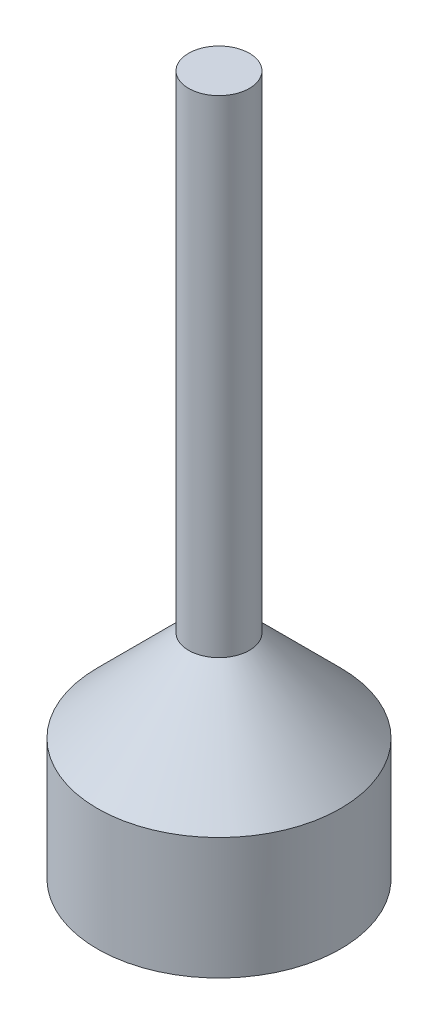
ISO-10303-21;
HEADER;
FILE_DESCRIPTION(('STEP AP214'),'2;1');
FILE_NAME('part.step','',(''),(''),'','','');
FILE_SCHEMA(('AUTOMOTIVE_DESIGN { 1 0 10303 214 1 1 1 1 }'));
ENDSEC;
DATA;
#1=APPLICATION_CONTEXT('core data for automotive mechanical design processes');
#2=APPLICATION_PROTOCOL_DEFINITION('international standard','automotive_design',2000,#1);
#3=PRODUCT_CONTEXT('',#1,'mechanical');
#4=PRODUCT('Part','Part','',(#3));
#5=PRODUCT_RELATED_PRODUCT_CATEGORY('part','',(#4));
#6=PRODUCT_DEFINITION_FORMATION('','',#4);
#7=PRODUCT_DEFINITION_CONTEXT('part definition',#1,'design');
#8=PRODUCT_DEFINITION('design','',#6,#7);
#9=PRODUCT_DEFINITION_SHAPE('','',#8);
#10=(LENGTH_UNIT() NAMED_UNIT(*) SI_UNIT(.MILLI.,.METRE.));
#11=(NAMED_UNIT(*) PLANE_ANGLE_UNIT() SI_UNIT($,.RADIAN.));
#12=(NAMED_UNIT(*) SI_UNIT($,.STERADIAN.) SOLID_ANGLE_UNIT());
#13=UNCERTAINTY_MEASURE_WITH_UNIT(LENGTH_MEASURE(1.E-05),#10,'distance_accuracy_value','');
#14=(GEOMETRIC_REPRESENTATION_CONTEXT(3) GLOBAL_UNCERTAINTY_ASSIGNED_CONTEXT((#13)) GLOBAL_UNIT_ASSIGNED_CONTEXT((#10,
#11,#12)) REPRESENTATION_CONTEXT('',''));
#15=CARTESIAN_POINT('',(0.,0.,0.));
#16=DIRECTION('',(0.,0.,1.));
#17=DIRECTION('',(1.,0.,0.));
#18=AXIS2_PLACEMENT_3D('',#15,#16,#17);
#19=CARTESIAN_POINT('',(0.,0.,0.));
#20=DIRECTION('',(0.,-1.,0.));
#21=DIRECTION('',(1.,0.,0.));
#22=AXIS2_PLACEMENT_3D('',#19,#20,#21);
#23=PLANE('',#22);
#24=CARTESIAN_POINT('',(0.,0.,0.));
#25=DIRECTION('',(0.,1.,0.));
#26=DIRECTION('',(-1.,0.,0.));
#27=AXIS2_PLACEMENT_3D('',#24,#25,#26);
#28=CIRCLE('',#27,20.);
#29=CARTESIAN_POINT('',(-20.,0.,0.));
#30=VERTEX_POINT('',#29);
#31=EDGE_CURVE('E10',#30,#30,#28,.T.);
#32=ORIENTED_EDGE('',*,*,#31,.F.);
#33=EDGE_LOOP('',(#32));
#34=FACE_BOUND('',#33,.T.);
#35=ADVANCED_FACE('F33',(#34),#23,.T.);
#36=CARTESIAN_POINT('',(0.,115.,0.));
#37=DIRECTION('',(0.,1.,0.));
#38=DIRECTION('',(-1.,0.,0.));
#39=AXIS2_PLACEMENT_3D('',#36,#37,#38);
#40=CYLINDRICAL_SURFACE('',#39,20.);
#41=ORIENTED_EDGE('',*,*,#31,.T.);
#42=EDGE_LOOP('',(#41));
#43=FACE_BOUND('',#42,.T.);
#44=CARTESIAN_POINT('',(0.,20.0000000000002,0.));
#45=DIRECTION('',(0.,1.,0.));
#46=DIRECTION('',(-1.,0.,0.));
#47=AXIS2_PLACEMENT_3D('',#44,#45,#46);
#48=CIRCLE('',#47,20.);
#49=CARTESIAN_POINT('',(20.,20.0000000000002,0.));
#50=VERTEX_POINT('',#49);
#51=EDGE_CURVE('E39',#50,#50,#48,.T.);
#52=ORIENTED_EDGE('',*,*,#51,.F.);
#53=EDGE_LOOP('',(#52));
#54=FACE_BOUND('',#53,.T.);
#55=ADVANCED_FACE('F65',(#43,#54),#40,.T.);
#56=CARTESIAN_POINT('',(0.,35.,0.));
#57=DIRECTION('',(0.,-1.,0.));
#58=DIRECTION('',(1.,0.,0.));
#59=AXIS2_PLACEMENT_3D('',#56,#57,#58);
#60=CONICAL_SURFACE('',#59,5.,0.785398163397453);
#61=CARTESIAN_POINT('',(0.,35.,0.));
#62=DIRECTION('',(0.,1.,0.));
#63=DIRECTION('',(-1.,0.,0.));
#64=AXIS2_PLACEMENT_3D('',#61,#62,#63);
#65=CIRCLE('',#64,5.);
#66=CARTESIAN_POINT('',(4.99999999999999,35.,0.));
#67=VERTEX_POINT('',#66);
#68=EDGE_CURVE('E43',#67,#67,#65,.T.);
#69=CARTESIAN_POINT('',(20.,20.0000000000002,0.));
#70=CARTESIAN_POINT('',(19.84375,20.1562500000002,0.));
#71=CARTESIAN_POINT('',(19.6875,20.3125000000002,0.));
#72=CARTESIAN_POINT('',(19.375,20.6250000000002,0.));
#73=CARTESIAN_POINT('',(19.21875,20.7812500000001,0.));
#74=CARTESIAN_POINT('',(18.90625,21.0937500000001,0.));
#75=CARTESIAN_POINT('',(18.75,21.2500000000001,0.));
#76=CARTESIAN_POINT('',(18.4375,21.5625000000001,0.));
#77=CARTESIAN_POINT('',(18.28125,21.7187500000001,0.));
#78=CARTESIAN_POINT('',(17.96875,22.0312500000001,0.));
#79=CARTESIAN_POINT('',(17.8125,22.1875000000001,0.));
#80=CARTESIAN_POINT('',(17.5,22.5000000000001,0.));
#81=CARTESIAN_POINT('',(17.34375,22.6562500000001,0.));
#82=CARTESIAN_POINT('',(17.03125,22.9687500000001,0.));
#83=CARTESIAN_POINT('',(16.875,23.1250000000001,0.));
#84=CARTESIAN_POINT('',(16.5625,23.4375000000001,0.));
#85=CARTESIAN_POINT('',(16.40625,23.5937500000001,0.));
#86=CARTESIAN_POINT('',(16.09375,23.9062500000001,0.));
#87=CARTESIAN_POINT('',(15.9375,24.0625000000001,0.));
#88=CARTESIAN_POINT('',(15.625,24.3750000000001,0.));
#89=CARTESIAN_POINT('',(15.46875,24.5312500000001,0.));
#90=CARTESIAN_POINT('',(15.15625,24.8437500000001,0.));
#91=CARTESIAN_POINT('',(15.,25.0000000000001,0.));
#92=CARTESIAN_POINT('',(14.6875,25.3125000000001,0.));
#93=CARTESIAN_POINT('',(14.53125,25.4687500000001,0.));
#94=CARTESIAN_POINT('',(14.21875,25.7812500000001,0.));
#95=CARTESIAN_POINT('',(14.0625,25.9375000000001,0.));
#96=CARTESIAN_POINT('',(13.75,26.2500000000001,0.));
#97=CARTESIAN_POINT('',(13.59375,26.4062500000001,0.));
#98=CARTESIAN_POINT('',(13.28125,26.7187500000001,0.));
#99=CARTESIAN_POINT('',(13.125,26.8750000000001,0.));
#100=CARTESIAN_POINT('',(12.8125,27.1875000000001,0.));
#101=CARTESIAN_POINT('',(12.65625,27.3437500000001,0.));
#102=CARTESIAN_POINT('',(12.34375,27.6562500000001,0.));
#103=CARTESIAN_POINT('',(12.1875,27.8125000000001,0.));
#104=CARTESIAN_POINT('',(11.875,28.1250000000001,0.));
#105=CARTESIAN_POINT('',(11.71875,28.2812500000001,0.));
#106=CARTESIAN_POINT('',(11.40625,28.5937500000001,0.));
#107=CARTESIAN_POINT('',(11.25,28.7500000000001,0.));
#108=CARTESIAN_POINT('',(10.9375,29.0625000000001,0.));
#109=CARTESIAN_POINT('',(10.78125,29.2187500000001,0.));
#110=CARTESIAN_POINT('',(10.46875,29.5312500000001,0.));
#111=CARTESIAN_POINT('',(10.3125,29.6875000000001,0.));
#112=CARTESIAN_POINT('',(9.99999999999999,30.0000000000001,0.));
#113=CARTESIAN_POINT('',(9.84374999999999,30.1562500000001,0.));
#114=CARTESIAN_POINT('',(9.53124999999999,30.4687500000001,0.));
#115=CARTESIAN_POINT('',(9.37499999999999,30.6250000000001,0.));
#116=CARTESIAN_POINT('',(9.06249999999999,30.9375,0.));
#117=CARTESIAN_POINT('',(8.90624999999999,31.09375,0.));
#118=CARTESIAN_POINT('',(8.59374999999999,31.40625,0.));
#119=CARTESIAN_POINT('',(8.43749999999999,31.5625,0.));
#120=CARTESIAN_POINT('',(8.12499999999999,31.875,0.));
#121=CARTESIAN_POINT('',(7.96874999999999,32.03125,0.));
#122=CARTESIAN_POINT('',(7.65624999999999,32.34375,0.));
#123=CARTESIAN_POINT('',(7.49999999999999,32.5,0.));
#124=CARTESIAN_POINT('',(7.18749999999999,32.8125,0.));
#125=CARTESIAN_POINT('',(7.03124999999999,32.96875,0.));
#126=CARTESIAN_POINT('',(6.71874999999999,33.28125,0.));
#127=CARTESIAN_POINT('',(6.56249999999999,33.4375,0.));
#128=CARTESIAN_POINT('',(6.24999999999999,33.75,0.));
#129=CARTESIAN_POINT('',(6.09374999999999,33.90625,0.));
#130=CARTESIAN_POINT('',(5.78124999999999,34.21875,0.));
#131=CARTESIAN_POINT('',(5.62499999999999,34.375,0.));
#132=CARTESIAN_POINT('',(5.31249999999999,34.6875,0.));
#133=CARTESIAN_POINT('',(5.15624999999999,34.84375,0.));
#134=CARTESIAN_POINT('',(4.99999999999999,35.,0.));
#135=B_SPLINE_CURVE_WITH_KNOTS('',3,(#69,#70,#71,#72,#73,#74,#75,#76,#77,#78,#79,#80,#81,#82,
#83,#84,#85,#86,#87,#88,#89,#90,#91,#92,#93,#94,#95,#96,#97,#98,#99,#100,#101,#102,#103,#104,
#105,#106,#107,#108,#109,#110,#111,#112,#113,#114,#115,#116,#117,#118,#119,#120,#121,#122,#123,
#124,#125,#126,#127,#128,#129,#130,#131,#132,#133,#134),.UNSPECIFIED.,.F.,.F.,(4,2,2,2,2,2,2,2,
2,2,2,2,2,2,2,2,2,2,2,2,2,2,2,2,2,2,2,2,2,2,2,2,4),(0.,0.662912607362382,1.32582521472477,
1.98873782208715,2.65165042944954,3.31456303681192,3.97747564417431,4.6403882515367,
5.30330085889908,5.96621346626146,6.62912607362385,7.29203868098624,7.95495128834862,
8.61786389571101,9.28077650307339,9.94368911043578,10.6066017177982,11.2695143251605,
11.9324269325229,12.5953395398853,13.2582521472477,13.9211647546101,14.5840773619725,
15.2469899693349,15.9099025766972,16.5728151840596,17.235727791422,17.8986403987844,
18.5615530061468,19.2244656135092,19.8873782208715,20.5502908282339,21.2132034355963),.UNSPECIFIED.);
#136=EDGE_CURVE('BSEAM57',#50,#67,#135,.T.);
#137=ORIENTED_EDGE('',*,*,#51,.T.);
#138=ORIENTED_EDGE('',*,*,#68,.F.);
#139=ORIENTED_EDGE('',*,*,#136,.T.);
#140=ORIENTED_EDGE('',*,*,#136,.F.);
#141=EDGE_LOOP('',(#137,#139,#138,#140));
#142=FACE_BOUND('',#141,.T.);
#143=ADVANCED_FACE('F57',(#142),#60,.T.);
#144=CARTESIAN_POINT('',(0.,115.,0.));
#145=DIRECTION('',(0.,1.,0.));
#146=DIRECTION('',(-1.,0.,0.));
#147=AXIS2_PLACEMENT_3D('',#144,#145,#146);
#148=CYLINDRICAL_SURFACE('',#147,5.);
#149=ORIENTED_EDGE('',*,*,#68,.T.);
#150=EDGE_LOOP('',(#149));
#151=FACE_BOUND('',#150,.T.);
#152=CARTESIAN_POINT('',(0.,115.,0.));
#153=DIRECTION('',(0.,1.,0.));
#154=DIRECTION('',(-1.,0.,0.));
#155=AXIS2_PLACEMENT_3D('',#152,#153,#154);
#156=CIRCLE('',#155,5.);
#157=CARTESIAN_POINT('',(-5.,115.,0.));
#158=VERTEX_POINT('',#157);
#159=EDGE_CURVE('E47',#158,#158,#156,.T.);
#160=ORIENTED_EDGE('',*,*,#159,.F.);
#161=EDGE_LOOP('',(#160));
#162=FACE_BOUND('',#161,.T.);
#163=ADVANCED_FACE('F55',(#151,#162),#148,.T.);
#164=CARTESIAN_POINT('',(-5.,115.,0.));
#165=DIRECTION('',(0.,1.,0.));
#166=DIRECTION('',(-1.,0.,0.));
#167=AXIS2_PLACEMENT_3D('',#164,#165,#166);
#168=PLANE('',#167);
#169=ORIENTED_EDGE('',*,*,#159,.T.);
#170=EDGE_LOOP('',(#169));
#171=FACE_BOUND('',#170,.T.);
#172=ADVANCED_FACE('F53',(#171),#168,.T.);
#173=CLOSED_SHELL('',(#35,#55,#143,#163,#172));
#174=MANIFOLD_SOLID_BREP('B2',#173);
#175=ADVANCED_BREP_SHAPE_REPRESENTATION('',(#18,#174),#14);
#176=SHAPE_DEFINITION_REPRESENTATION(#9,#175);
ENDSEC;
END-ISO-10303-21;
